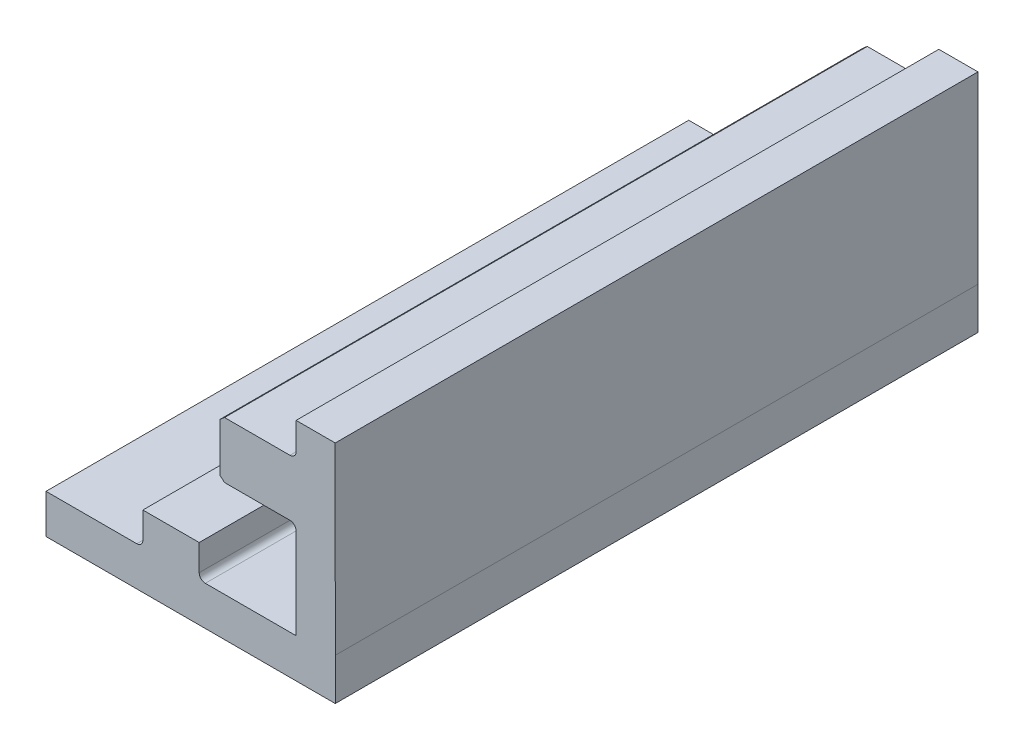
ISO-10303-21;
HEADER;
FILE_DESCRIPTION(('STEP AP214'),'2;1');
FILE_NAME('part.step','',(''),(''),'','','');
FILE_SCHEMA(('AUTOMOTIVE_DESIGN { 1 0 10303 214 1 1 1 1 }'));
ENDSEC;
DATA;
#1=APPLICATION_CONTEXT('core data for automotive mechanical design processes');
#2=APPLICATION_PROTOCOL_DEFINITION('international standard','automotive_design',2000,#1);
#3=PRODUCT_CONTEXT('',#1,'mechanical');
#4=PRODUCT('Part','Part','',(#3));
#5=PRODUCT_RELATED_PRODUCT_CATEGORY('part','',(#4));
#6=PRODUCT_DEFINITION_FORMATION('','',#4);
#7=PRODUCT_DEFINITION_CONTEXT('part definition',#1,'design');
#8=PRODUCT_DEFINITION('design','',#6,#7);
#9=PRODUCT_DEFINITION_SHAPE('','',#8);
#10=(LENGTH_UNIT() NAMED_UNIT(*) SI_UNIT(.MILLI.,.METRE.));
#11=(NAMED_UNIT(*) PLANE_ANGLE_UNIT() SI_UNIT($,.RADIAN.));
#12=(NAMED_UNIT(*) SI_UNIT($,.STERADIAN.) SOLID_ANGLE_UNIT());
#13=UNCERTAINTY_MEASURE_WITH_UNIT(LENGTH_MEASURE(1.E-05),#10,'distance_accuracy_value','');
#14=(GEOMETRIC_REPRESENTATION_CONTEXT(3) GLOBAL_UNCERTAINTY_ASSIGNED_CONTEXT((#13)) GLOBAL_UNIT_ASSIGNED_CONTEXT((#10,
#11,#12)) REPRESENTATION_CONTEXT('',''));
#15=CARTESIAN_POINT('',(0.,0.,0.));
#16=DIRECTION('',(0.,0.,1.));
#17=DIRECTION('',(1.,0.,0.));
#18=AXIS2_PLACEMENT_3D('',#15,#16,#17);
#19=CARTESIAN_POINT('',(17.7288391379452,22.9352063032006,-3749.675));
#20=DIRECTION('',(0.,-1.,0.));
#21=DIRECTION('',(0.,0.,-1.));
#22=AXIS2_PLACEMENT_3D('',#19,#20,#21);
#23=PLANE('',#22);
#24=DIRECTION('',(1.,0.,0.));
#25=VECTOR('',#24,1.);
#26=CARTESIAN_POINT('',(17.7288391379452,22.9352063032006,-3683.));
#27=LINE('',#26,#25);
#28=CARTESIAN_POINT('',(17.7288391379452,22.9352063032006,-3683.));
#29=VERTEX_POINT('',#28);
#30=CARTESIAN_POINT('',(21.7872141992322,22.9352063032006,-3683.));
#31=VERTEX_POINT('',#30);
#32=EDGE_CURVE('E296',#29,#31,#27,.T.);
#33=ORIENTED_EDGE('',*,*,#32,.T.);
#34=DIRECTION('',(0.,0.,1.));
#35=VECTOR('',#34,1.);
#36=CARTESIAN_POINT('',(21.7872141992322,22.9352063032006,-3749.675));
#37=LINE('',#36,#35);
#38=CARTESIAN_POINT('',(21.7872141992322,22.9352063032006,-3749.675));
#39=VERTEX_POINT('',#38);
#40=EDGE_CURVE('E11',#39,#31,#37,.T.);
#41=ORIENTED_EDGE('',*,*,#40,.F.);
#42=DIRECTION('',(1.,0.,0.));
#43=VECTOR('',#42,1.);
#44=CARTESIAN_POINT('',(17.7288391379452,22.9352063032006,-3749.675));
#45=LINE('',#44,#43);
#46=CARTESIAN_POINT('',(17.7288391379452,22.9352063032006,-3749.675));
#47=VERTEX_POINT('',#46);
#48=EDGE_CURVE('E230',#47,#39,#45,.T.);
#49=ORIENTED_EDGE('',*,*,#48,.F.);
#50=DIRECTION('',(0.,0.,1.));
#51=VECTOR('',#50,1.);
#52=CARTESIAN_POINT('',(17.7288391379452,22.9352063032006,-3749.675));
#53=LINE('',#52,#51);
#54=EDGE_CURVE('E231',#47,#29,#53,.T.);
#55=ORIENTED_EDGE('',*,*,#54,.T.);
#56=EDGE_LOOP('',(#33,#41,#49,#55));
#57=FACE_BOUND('',#56,.T.);
#58=ADVANCED_FACE('F33',(#57),#23,.F.);
#59=CARTESIAN_POINT('',(21.7872141992322,22.9352063032006,-3749.675));
#60=DIRECTION('',(-0.999999969550356,-0.000246777810830954,0.));
#61=DIRECTION('',(0.000246777810830954,-0.999999969550356,0.));
#62=AXIS2_PLACEMENT_3D('',#59,#60,#61);
#63=PLANE('',#62);
#64=DIRECTION('',(0.000246777810830954,-0.999999969550356,0.));
#65=VECTOR('',#64,1.);
#66=CARTESIAN_POINT('',(21.7872141992322,22.9352063032006,-3683.));
#67=LINE('',#66,#65);
#68=CARTESIAN_POINT('',(21.791921752024,3.85912878792336,-3683.));
#69=VERTEX_POINT('',#68);
#70=EDGE_CURVE('E292',#31,#69,#67,.T.);
#71=ORIENTED_EDGE('',*,*,#70,.T.);
#72=DIRECTION('',(0.,0.,1.));
#73=VECTOR('',#72,1.);
#74=CARTESIAN_POINT('',(21.791921752024,3.85912878792336,-3749.675));
#75=LINE('',#74,#73);
#76=CARTESIAN_POINT('',(21.791921752024,3.85912878792336,-3749.675));
#77=VERTEX_POINT('',#76);
#78=EDGE_CURVE('E40',#77,#69,#75,.T.);
#79=ORIENTED_EDGE('',*,*,#78,.F.);
#80=DIRECTION('',(0.000246777810830954,-0.999999969550356,0.));
#81=VECTOR('',#80,1.);
#82=CARTESIAN_POINT('',(21.7872141992322,22.9352063032006,-3749.675));
#83=LINE('',#82,#81);
#84=EDGE_CURVE('E290',#39,#77,#83,.T.);
#85=ORIENTED_EDGE('',*,*,#84,.F.);
#86=ORIENTED_EDGE('',*,*,#40,.T.);
#87=EDGE_LOOP('',(#71,#79,#85,#86));
#88=FACE_BOUND('',#87,.T.);
#89=ADVANCED_FACE('F289',(#88),#63,.F.);
#90=CARTESIAN_POINT('',(21.791921752024,-0.47513727151985,-3749.675));
#91=DIRECTION('',(-1.,0.,0.));
#92=DIRECTION('',(0.,0.,1.));
#93=AXIS2_PLACEMENT_3D('',#90,#91,#92);
#94=PLANE('',#93);
#95=DIRECTION('',(0.,-1.,0.));
#96=VECTOR('',#95,1.);
#97=CARTESIAN_POINT('',(21.791921752024,-0.47513727151985,-3683.));
#98=LINE('',#97,#96);
#99=CARTESIAN_POINT('',(21.791921752024,-0.47513727151985,-3683.));
#100=VERTEX_POINT('',#99);
#101=EDGE_CURVE('E285',#69,#100,#98,.T.);
#102=ORIENTED_EDGE('',*,*,#101,.T.);
#103=DIRECTION('',(0.,0.,1.));
#104=VECTOR('',#103,1.);
#105=CARTESIAN_POINT('',(21.791921752024,-0.47513727151985,-3749.675));
#106=LINE('',#105,#104);
#107=CARTESIAN_POINT('',(21.791921752024,-0.47513727151985,-3749.675));
#108=VERTEX_POINT('',#107);
#109=EDGE_CURVE('E276',#108,#100,#106,.T.);
#110=ORIENTED_EDGE('',*,*,#109,.F.);
#111=DIRECTION('',(0.,-1.,0.));
#112=VECTOR('',#111,1.);
#113=CARTESIAN_POINT('',(21.791921752024,3.58886272848015,-3749.675));
#114=LINE('',#113,#112);
#115=EDGE_CURVE('E286',#77,#108,#114,.T.);
#116=ORIENTED_EDGE('',*,*,#115,.F.);
#117=ORIENTED_EDGE('',*,*,#78,.T.);
#118=EDGE_LOOP('',(#102,#110,#116,#117));
#119=FACE_BOUND('',#118,.T.);
#120=ADVANCED_FACE('F283',(#119),#94,.F.);
#121=CARTESIAN_POINT('',(-8.21549203864979,-0.47513727151985,-3749.675));
#122=DIRECTION('',(0.,1.,0.));
#123=DIRECTION('',(-1.,0.,0.));
#124=AXIS2_PLACEMENT_3D('',#121,#122,#123);
#125=PLANE('',#124);
#126=DIRECTION('',(-1.,0.,0.));
#127=VECTOR('',#126,1.);
#128=CARTESIAN_POINT('',(-8.21549203864979,-0.47513727151985,-3683.));
#129=LINE('',#128,#127);
#130=CARTESIAN_POINT('',(-8.21549203864979,-0.47513727151985,-3683.));
#131=VERTEX_POINT('',#130);
#132=EDGE_CURVE('E298',#100,#131,#129,.T.);
#133=ORIENTED_EDGE('',*,*,#132,.T.);
#134=DIRECTION('',(0.,0.,1.));
#135=VECTOR('',#134,1.);
#136=CARTESIAN_POINT('',(-8.21549203864979,-0.47513727151985,-3749.675));
#137=LINE('',#136,#135);
#138=CARTESIAN_POINT('',(-8.21549203864979,-0.47513727151985,-3749.675));
#139=VERTEX_POINT('',#138);
#140=EDGE_CURVE('E273',#139,#131,#137,.T.);
#141=ORIENTED_EDGE('',*,*,#140,.F.);
#142=DIRECTION('',(-1.,0.,0.));
#143=VECTOR('',#142,1.);
#144=CARTESIAN_POINT('',(17.7279217520239,-0.47513727151985,-3749.675));
#145=LINE('',#144,#143);
#146=EDGE_CURVE('E367',#108,#139,#145,.T.);
#147=ORIENTED_EDGE('',*,*,#146,.F.);
#148=ORIENTED_EDGE('',*,*,#109,.T.);
#149=EDGE_LOOP('',(#133,#141,#147,#148));
#150=FACE_BOUND('',#149,.T.);
#151=ADVANCED_FACE('F381',(#150),#125,.F.);
#152=CARTESIAN_POINT('',(-8.21549203864979,3.58886272848015,-3749.675));
#153=DIRECTION('',(1.,0.,0.));
#154=DIRECTION('',(0.,0.,-1.));
#155=AXIS2_PLACEMENT_3D('',#152,#153,#154);
#156=PLANE('',#155);
#157=DIRECTION('',(0.,1.,0.));
#158=VECTOR('',#157,1.);
#159=CARTESIAN_POINT('',(-8.21549203864979,3.58886272848015,-3683.));
#160=LINE('',#159,#158);
#161=CARTESIAN_POINT('',(-8.21549203864979,3.58886272848015,-3683.));
#162=VERTEX_POINT('',#161);
#163=EDGE_CURVE('E305',#131,#162,#160,.T.);
#164=ORIENTED_EDGE('',*,*,#163,.T.);
#165=DIRECTION('',(0.,0.,1.));
#166=VECTOR('',#165,1.);
#167=CARTESIAN_POINT('',(-8.21549203864979,3.58886272848015,-3749.675));
#168=LINE('',#167,#166);
#169=CARTESIAN_POINT('',(-8.21549203864979,3.58886272848015,-3749.675));
#170=VERTEX_POINT('',#169);
#171=EDGE_CURVE('E270',#170,#162,#168,.T.);
#172=ORIENTED_EDGE('',*,*,#171,.F.);
#173=DIRECTION('',(0.,1.,0.));
#174=VECTOR('',#173,1.);
#175=CARTESIAN_POINT('',(-8.21549203864979,3.58886272848015,-3749.675));
#176=LINE('',#175,#174);
#177=EDGE_CURVE('E369',#139,#170,#176,.T.);
#178=ORIENTED_EDGE('',*,*,#177,.F.);
#179=ORIENTED_EDGE('',*,*,#140,.T.);
#180=EDGE_LOOP('',(#164,#172,#178,#179));
#181=FACE_BOUND('',#180,.T.);
#182=ADVANCED_FACE('F377',(#181),#156,.F.);
#183=CARTESIAN_POINT('',(-7.94526589326117,3.58886272848015,-3749.675));
#184=DIRECTION('',(0.,-1.,0.));
#185=DIRECTION('',(1.,0.,0.));
#186=AXIS2_PLACEMENT_3D('',#183,#184,#185);
#187=PLANE('',#186);
#188=DIRECTION('',(1.,0.,0.));
#189=VECTOR('',#188,1.);
#190=CARTESIAN_POINT('',(-7.94526589326117,3.58886272848015,-3683.));
#191=LINE('',#190,#189);
#192=CARTESIAN_POINT('',(1.19873410673898,3.58886272848015,-3683.));
#193=VERTEX_POINT('',#192);
#194=EDGE_CURVE('E308',#162,#193,#191,.T.);
#195=ORIENTED_EDGE('',*,*,#194,.T.);
#196=DIRECTION('',(0.,0.,1.));
#197=VECTOR('',#196,1.);
#198=CARTESIAN_POINT('',(1.19873410673898,3.58886272848015,-3749.675));
#199=LINE('',#198,#197);
#200=CARTESIAN_POINT('',(1.19873410673898,3.58886272848015,-3749.675));
#201=VERTEX_POINT('',#200);
#202=EDGE_CURVE('E267',#201,#193,#199,.T.);
#203=ORIENTED_EDGE('',*,*,#202,.F.);
#204=DIRECTION('',(1.,0.,0.));
#205=VECTOR('',#204,1.);
#206=CARTESIAN_POINT('',(-8.21549203864979,3.58886272848015,-3749.675));
#207=LINE('',#206,#205);
#208=EDGE_CURVE('E325',#170,#201,#207,.T.);
#209=ORIENTED_EDGE('',*,*,#208,.F.);
#210=ORIENTED_EDGE('',*,*,#171,.T.);
#211=EDGE_LOOP('',(#195,#203,#209,#210));
#212=FACE_BOUND('',#211,.T.);
#213=ADVANCED_FACE('F374',(#212),#187,.F.);
#214=CARTESIAN_POINT('',(1.19873410673898,4.22386272848,-3749.675));
#215=DIRECTION('',(0.,0.,1.));
#216=DIRECTION('',(1.,0.,0.));
#217=AXIS2_PLACEMENT_3D('',#214,#215,#216);
#218=CYLINDRICAL_SURFACE('',#217,0.634999999999852);
#219=CARTESIAN_POINT('',(1.19873410673898,4.22386272848,-3683.));
#220=DIRECTION('',(0.,0.,1.));
#221=DIRECTION('',(1.,0.,0.));
#222=AXIS2_PLACEMENT_3D('',#219,#220,#221);
#223=CIRCLE('',#222,0.634999999999852);
#224=CARTESIAN_POINT('',(1.83373410673883,4.22386272848,-3683.));
#225=VERTEX_POINT('',#224);
#226=EDGE_CURVE('E205',#193,#225,#223,.T.);
#227=ORIENTED_EDGE('',*,*,#226,.T.);
#228=DIRECTION('',(0.,0.,1.));
#229=VECTOR('',#228,1.);
#230=CARTESIAN_POINT('',(1.83373410673883,4.22386272848,-3749.675));
#231=LINE('',#230,#229);
#232=CARTESIAN_POINT('',(1.83373410673883,4.22386272848,-3749.675));
#233=VERTEX_POINT('',#232);
#234=EDGE_CURVE('E264',#233,#225,#231,.T.);
#235=ORIENTED_EDGE('',*,*,#234,.F.);
#236=CARTESIAN_POINT('',(1.19873410673898,4.22386272848,-3749.675));
#237=DIRECTION('',(0.,0.,1.));
#238=DIRECTION('',(1.,0.,0.));
#239=AXIS2_PLACEMENT_3D('',#236,#237,#238);
#240=CIRCLE('',#239,0.634999999999852);
#241=EDGE_CURVE('E321',#201,#233,#240,.T.);
#242=ORIENTED_EDGE('',*,*,#241,.F.);
#243=ORIENTED_EDGE('',*,*,#202,.T.);
#244=EDGE_LOOP('',(#227,#235,#242,#243));
#245=FACE_BOUND('',#244,.T.);
#246=ADVANCED_FACE('F312',(#245),#218,.F.);
#247=CARTESIAN_POINT('',(1.83373410673883,4.22386272848,-3749.675));
#248=DIRECTION('',(1.,0.,0.));
#249=DIRECTION('',(0.,0.,-1.));
#250=AXIS2_PLACEMENT_3D('',#247,#248,#249);
#251=PLANE('',#250);
#252=DIRECTION('',(0.,1.,0.));
#253=VECTOR('',#252,1.);
#254=CARTESIAN_POINT('',(1.83373410673883,4.22386272848,-3683.));
#255=LINE('',#254,#253);
#256=CARTESIAN_POINT('',(1.83373410673883,6.93539089348943,-3683.));
#257=VERTEX_POINT('',#256);
#258=EDGE_CURVE('E201',#225,#257,#255,.T.);
#259=ORIENTED_EDGE('',*,*,#258,.T.);
#260=DIRECTION('',(0.,0.,-1.));
#261=VECTOR('',#260,1.);
#262=CARTESIAN_POINT('',(1.83373410673883,6.93539089348943,-3683.));
#263=LINE('',#262,#261);
#264=CARTESIAN_POINT('',(1.83373410673883,6.93539089348943,-3749.675));
#265=VERTEX_POINT('',#264);
#266=EDGE_CURVE('E47',#257,#265,#263,.T.);
#267=ORIENTED_EDGE('',*,*,#266,.T.);
#268=DIRECTION('',(0.,1.,0.));
#269=VECTOR('',#268,1.);
#270=CARTESIAN_POINT('',(1.83373410673883,4.22386272848,-3749.675));
#271=LINE('',#270,#269);
#272=EDGE_CURVE('E319',#233,#265,#271,.T.);
#273=ORIENTED_EDGE('',*,*,#272,.F.);
#274=ORIENTED_EDGE('',*,*,#234,.T.);
#275=EDGE_LOOP('',(#259,#267,#273,#274));
#276=FACE_BOUND('',#275,.T.);
#277=ADVANCED_FACE('F317',(#276),#251,.F.);
#278=CARTESIAN_POINT('',(7.67573410673884,5.7478627284803,-3749.675));
#279=DIRECTION('',(-1.,0.,0.));
#280=DIRECTION('',(0.,0.,1.));
#281=AXIS2_PLACEMENT_3D('',#278,#279,#280);
#282=PLANE('',#281);
#283=DIRECTION('',(0.,-1.,0.));
#284=VECTOR('',#283,1.);
#285=CARTESIAN_POINT('',(7.67573410673884,5.7478627284803,-3749.675));
#286=LINE('',#285,#284);
#287=CARTESIAN_POINT('',(7.67573410673884,6.93539089348943,-3749.675));
#288=VERTEX_POINT('',#287);
#289=CARTESIAN_POINT('',(7.67573410673884,4.22386272848,-3749.675));
#290=VERTEX_POINT('',#289);
#291=EDGE_CURVE('E195',#288,#290,#286,.T.);
#292=ORIENTED_EDGE('',*,*,#291,.F.);
#293=DIRECTION('',(0.,0.,-1.));
#294=VECTOR('',#293,1.);
#295=CARTESIAN_POINT('',(7.67573410673884,6.93539089348943,-3683.));
#296=LINE('',#295,#294);
#297=CARTESIAN_POINT('',(7.67573410673884,6.93539089348943,-3683.));
#298=VERTEX_POINT('',#297);
#299=EDGE_CURVE('E182',#298,#288,#296,.T.);
#300=ORIENTED_EDGE('',*,*,#299,.F.);
#301=DIRECTION('',(0.,-1.,0.));
#302=VECTOR('',#301,1.);
#303=CARTESIAN_POINT('',(7.67573410673884,5.7478627284803,-3683.));
#304=LINE('',#303,#302);
#305=CARTESIAN_POINT('',(7.67573410673884,4.22386272848,-3683.));
#306=VERTEX_POINT('',#305);
#307=EDGE_CURVE('E193',#298,#306,#304,.T.);
#308=ORIENTED_EDGE('',*,*,#307,.T.);
#309=DIRECTION('',(0.,0.,1.));
#310=VECTOR('',#309,1.);
#311=CARTESIAN_POINT('',(7.67573410673884,4.22386272848,-3749.675));
#312=LINE('',#311,#310);
#313=EDGE_CURVE('E262',#290,#306,#312,.T.);
#314=ORIENTED_EDGE('',*,*,#313,.F.);
#315=EDGE_LOOP('',(#292,#300,#308,#314));
#316=FACE_BOUND('',#315,.T.);
#317=ADVANCED_FACE('F191',(#316),#282,.F.);
#318=CARTESIAN_POINT('',(8.31073410673869,4.22386272848,-3749.675));
#319=DIRECTION('',(0.,0.,1.));
#320=DIRECTION('',(1.,0.,0.));
#321=AXIS2_PLACEMENT_3D('',#318,#319,#320);
#322=CYLINDRICAL_SURFACE('',#321,0.634999999999847);
#323=CARTESIAN_POINT('',(8.31073410673869,4.22386272848,-3683.));
#324=DIRECTION('',(0.,0.,1.));
#325=DIRECTION('',(1.,0.,0.));
#326=AXIS2_PLACEMENT_3D('',#323,#324,#325);
#327=CIRCLE('',#326,0.634999999999847);
#328=CARTESIAN_POINT('',(8.31073410673869,3.58886272848015,-3683.));
#329=VERTEX_POINT('',#328);
#330=EDGE_CURVE('E200',#306,#329,#327,.T.);
#331=ORIENTED_EDGE('',*,*,#330,.T.);
#332=DIRECTION('',(0.,0.,1.));
#333=VECTOR('',#332,1.);
#334=CARTESIAN_POINT('',(8.31073410673869,3.58886272848015,-3749.675));
#335=LINE('',#334,#333);
#336=CARTESIAN_POINT('',(8.31073410673869,3.58886272848015,-3749.675));
#337=VERTEX_POINT('',#336);
#338=EDGE_CURVE('E259',#337,#329,#335,.T.);
#339=ORIENTED_EDGE('',*,*,#338,.F.);
#340=CARTESIAN_POINT('',(8.31073410673869,4.22386272848,-3749.675));
#341=DIRECTION('',(0.,0.,1.));
#342=DIRECTION('',(1.,0.,0.));
#343=AXIS2_PLACEMENT_3D('',#340,#341,#342);
#344=CIRCLE('',#343,0.634999999999847);
#345=EDGE_CURVE('E323',#290,#337,#344,.T.);
#346=ORIENTED_EDGE('',*,*,#345,.F.);
#347=ORIENTED_EDGE('',*,*,#313,.T.);
#348=EDGE_LOOP('',(#331,#339,#346,#347));
#349=FACE_BOUND('',#348,.T.);
#350=ADVANCED_FACE('F437',(#349),#322,.F.);
#351=CARTESIAN_POINT('',(17.4547341067388,3.58886272848015,-3749.675));
#352=DIRECTION('',(0.,-1.,0.));
#353=DIRECTION('',(1.,0.,0.));
#354=AXIS2_PLACEMENT_3D('',#351,#352,#353);
#355=PLANE('',#354);
#356=DIRECTION('',(1.,0.,0.));
#357=VECTOR('',#356,1.);
#358=CARTESIAN_POINT('',(17.4547341067388,3.58886272848015,-3683.));
#359=LINE('',#358,#357);
#360=CARTESIAN_POINT('',(17.7279217520239,3.58886272848015,-3683.));
#361=VERTEX_POINT('',#360);
#362=EDGE_CURVE('E203',#329,#361,#359,.T.);
#363=ORIENTED_EDGE('',*,*,#362,.T.);
#364=DIRECTION('',(0.,0.,1.));
#365=VECTOR('',#364,1.);
#366=CARTESIAN_POINT('',(17.7279217520239,3.58886272848015,-3749.675));
#367=LINE('',#366,#365);
#368=CARTESIAN_POINT('',(17.7279217520239,3.58886272848015,-3749.675));
#369=VERTEX_POINT('',#368);
#370=EDGE_CURVE('E256',#369,#361,#367,.T.);
#371=ORIENTED_EDGE('',*,*,#370,.F.);
#372=DIRECTION('',(1.,0.,0.));
#373=VECTOR('',#372,1.);
#374=CARTESIAN_POINT('',(8.31073410673869,3.58886272848015,-3749.675));
#375=LINE('',#374,#373);
#376=EDGE_CURVE('E330',#337,#369,#375,.T.);
#377=ORIENTED_EDGE('',*,*,#376,.F.);
#378=ORIENTED_EDGE('',*,*,#338,.T.);
#379=EDGE_LOOP('',(#363,#371,#377,#378));
#380=FACE_BOUND('',#379,.T.);
#381=ADVANCED_FACE('F442',(#380),#355,.F.);
#382=CARTESIAN_POINT('',(17.7279217520239,3.58886272848015,-3749.675));
#383=DIRECTION('',(1.,0.,0.));
#384=DIRECTION('',(0.,0.,-1.));
#385=AXIS2_PLACEMENT_3D('',#382,#383,#384);
#386=PLANE('',#385);
#387=DIRECTION('',(0.,1.,0.));
#388=VECTOR('',#387,1.);
#389=CARTESIAN_POINT('',(17.7279217520239,3.58886272848015,-3683.));
#390=LINE('',#389,#388);
#391=CARTESIAN_POINT('',(17.7279217520239,3.85884275420049,-3683.));
#392=VERTEX_POINT('',#391);
#393=EDGE_CURVE('E210',#361,#392,#390,.T.);
#394=ORIENTED_EDGE('',*,*,#393,.T.);
#395=DIRECTION('',(0.,0.,1.));
#396=VECTOR('',#395,1.);
#397=CARTESIAN_POINT('',(17.7279217520239,3.85884275420049,-3749.675));
#398=LINE('',#397,#396);
#399=CARTESIAN_POINT('',(17.7279217520239,3.85884275420049,-3749.675));
#400=VERTEX_POINT('',#399);
#401=EDGE_CURVE('E253',#400,#392,#398,.T.);
#402=ORIENTED_EDGE('',*,*,#401,.F.);
#403=DIRECTION('',(0.,1.,0.));
#404=VECTOR('',#403,1.);
#405=CARTESIAN_POINT('',(17.7279217520239,3.58886272848015,-3749.675));
#406=LINE('',#405,#404);
#407=EDGE_CURVE('E332',#369,#400,#406,.T.);
#408=ORIENTED_EDGE('',*,*,#407,.F.);
#409=ORIENTED_EDGE('',*,*,#370,.T.);
#410=EDGE_LOOP('',(#394,#402,#408,#409));
#411=FACE_BOUND('',#410,.T.);
#412=ADVANCED_FACE('F455',(#411),#386,.F.);
#413=CARTESIAN_POINT('',(17.7279217520239,3.85884275420049,-3749.675));
#414=DIRECTION('',(0.999999998843667,-4.80901885618899E-05,0.));
#415=DIRECTION('',(4.80901885618899E-05,0.999999998843667,0.));
#416=AXIS2_PLACEMENT_3D('',#413,#414,#415);
#417=PLANE('',#416);
#418=DIRECTION('',(4.80901885618899E-05,0.999999998843667,0.));
#419=VECTOR('',#418,1.);
#420=CARTESIAN_POINT('',(17.7279217520239,3.85884275420049,-3683.));
#421=LINE('',#420,#419);
#422=CARTESIAN_POINT('',(17.7283614660931,13.002372480981,-3683.));
#423=VERTEX_POINT('',#422);
#424=EDGE_CURVE('E212',#392,#423,#421,.T.);
#425=ORIENTED_EDGE('',*,*,#424,.T.);
#426=DIRECTION('',(0.,0.,1.));
#427=VECTOR('',#426,1.);
#428=CARTESIAN_POINT('',(17.7283614660931,13.002372480981,-3749.675));
#429=LINE('',#428,#427);
#430=CARTESIAN_POINT('',(17.7283614660931,13.002372480981,-3749.675));
#431=VERTEX_POINT('',#430);
#432=EDGE_CURVE('E250',#431,#423,#429,.T.);
#433=ORIENTED_EDGE('',*,*,#432,.F.);
#434=DIRECTION('',(4.80901885618899E-05,0.999999998843667,0.));
#435=VECTOR('',#434,1.);
#436=CARTESIAN_POINT('',(17.7279217520239,3.85884275420049,-3749.675));
#437=LINE('',#436,#435);
#438=EDGE_CURVE('E334',#400,#431,#437,.T.);
#439=ORIENTED_EDGE('',*,*,#438,.F.);
#440=ORIENTED_EDGE('',*,*,#401,.T.);
#441=EDGE_LOOP('',(#425,#433,#439,#440));
#442=FACE_BOUND('',#441,.T.);
#443=ADVANCED_FACE('F465',(#442),#417,.F.);
#444=CARTESIAN_POINT('',(17.0929217520241,13.0024030393967,-3749.675));
#445=DIRECTION('',(0.,0.,1.));
#446=DIRECTION('',(1.,0.,0.));
#447=AXIS2_PLACEMENT_3D('',#444,#445,#446);
#448=CYLINDRICAL_SURFACE('',#447,0.635439714803768);
#449=CARTESIAN_POINT('',(17.0929217520241,13.0024030393967,-3683.));
#450=DIRECTION('',(0.,0.,1.));
#451=DIRECTION('',(1.,0.,0.));
#452=AXIS2_PLACEMENT_3D('',#449,#450,#451);
#453=CIRCLE('',#452,0.635439714803768);
#454=CARTESIAN_POINT('',(17.0929217520241,13.6378427542005,-3683.));
#455=VERTEX_POINT('',#454);
#456=EDGE_CURVE('E214',#423,#455,#453,.T.);
#457=ORIENTED_EDGE('',*,*,#456,.T.);
#458=DIRECTION('',(0.,0.,1.));
#459=VECTOR('',#458,1.);
#460=CARTESIAN_POINT('',(17.0929217520241,13.6378427542005,-3749.675));
#461=LINE('',#460,#459);
#462=CARTESIAN_POINT('',(17.0929217520241,13.6378427542005,-3749.675));
#463=VERTEX_POINT('',#462);
#464=EDGE_CURVE('E247',#463,#455,#461,.T.);
#465=ORIENTED_EDGE('',*,*,#464,.F.);
#466=CARTESIAN_POINT('',(17.0929217520241,13.0024030393967,-3749.675));
#467=DIRECTION('',(0.,0.,1.));
#468=DIRECTION('',(1.,0.,0.));
#469=AXIS2_PLACEMENT_3D('',#466,#467,#468);
#470=CIRCLE('',#469,0.635439714803768);
#471=EDGE_CURVE('E336',#431,#463,#470,.T.);
#472=ORIENTED_EDGE('',*,*,#471,.F.);
#473=ORIENTED_EDGE('',*,*,#432,.T.);
#474=EDGE_LOOP('',(#457,#465,#472,#473));
#475=FACE_BOUND('',#474,.T.);
#476=ADVANCED_FACE('F475',(#475),#448,.F.);
#477=CARTESIAN_POINT('',(17.0929217520241,13.6378427542005,-3749.675));
#478=DIRECTION('',(0.,1.,0.));
#479=DIRECTION('',(-1.,0.,0.));
#480=AXIS2_PLACEMENT_3D('',#477,#478,#479);
#481=PLANE('',#480);
#482=DIRECTION('',(-1.,0.,0.));
#483=VECTOR('',#482,1.);
#484=CARTESIAN_POINT('',(17.0929217520241,13.6378427542005,-3683.));
#485=LINE('',#484,#483);
#486=CARTESIAN_POINT('',(10.3079798708025,13.6378427542006,-3683.));
#487=VERTEX_POINT('',#486);
#488=EDGE_CURVE('E216',#455,#487,#485,.T.);
#489=ORIENTED_EDGE('',*,*,#488,.T.);
#490=DIRECTION('',(0.,0.,1.));
#491=VECTOR('',#490,1.);
#492=CARTESIAN_POINT('',(10.3079798708025,13.6378427542006,-3749.676));
#493=LINE('',#492,#491);
#494=CARTESIAN_POINT('',(10.3079798708025,13.6378427542006,-3749.675));
#495=VERTEX_POINT('',#494);
#496=EDGE_CURVE('E363',#495,#487,#493,.T.);
#497=ORIENTED_EDGE('',*,*,#496,.F.);
#498=DIRECTION('',(-1.,0.,0.));
#499=VECTOR('',#498,1.);
#500=CARTESIAN_POINT('',(17.0929217520241,13.6378427542005,-3749.675));
#501=LINE('',#500,#499);
#502=EDGE_CURVE('E338',#463,#495,#501,.T.);
#503=ORIENTED_EDGE('',*,*,#502,.F.);
#504=ORIENTED_EDGE('',*,*,#464,.T.);
#505=EDGE_LOOP('',(#489,#497,#503,#504));
#506=FACE_BOUND('',#505,.T.);
#507=ADVANCED_FACE('F485',(#506),#481,.F.);
#508=CARTESIAN_POINT('',(14.4259217940422,10.1824792052005,-3749.675));
#509=DIRECTION('',(0.642787609686549,0.76604444311897,0.));
#510=DIRECTION('',(-0.76604444311897,0.642787609686549,0.));
#511=AXIS2_PLACEMENT_3D('',#508,#509,#510);
#512=PLANE('',#511);
#513=DIRECTION('',(-0.76604444311897,0.642787609686549,0.));
#514=VECTOR('',#513,1.);
#515=CARTESIAN_POINT('',(14.4259217940422,10.1824792052005,-3749.675));
#516=LINE('',#515,#514);
#517=CARTESIAN_POINT('',(9.85392175202405,14.0188427542006,-3749.675));
#518=VERTEX_POINT('',#517);
#519=EDGE_CURVE('E340',#495,#518,#516,.T.);
#520=ORIENTED_EDGE('',*,*,#519,.F.);
#521=ORIENTED_EDGE('',*,*,#496,.T.);
#522=DIRECTION('',(-0.76604444311897,0.642787609686549,0.));
#523=VECTOR('',#522,1.);
#524=CARTESIAN_POINT('',(14.4259217940422,10.1824792052005,-3683.));
#525=LINE('',#524,#523);
#526=CARTESIAN_POINT('',(9.85392175202405,14.0188427542006,-3683.));
#527=VERTEX_POINT('',#526);
#528=EDGE_CURVE('E218',#487,#527,#525,.T.);
#529=ORIENTED_EDGE('',*,*,#528,.T.);
#530=DIRECTION('',(0.,0.,1.));
#531=VECTOR('',#530,1.);
#532=CARTESIAN_POINT('',(9.85392175202405,14.0188427542006,-3749.675));
#533=LINE('',#532,#531);
#534=EDGE_CURVE('E244',#518,#527,#533,.T.);
#535=ORIENTED_EDGE('',*,*,#534,.F.);
#536=EDGE_LOOP('',(#520,#521,#529,#535));
#537=FACE_BOUND('',#536,.T.);
#538=ADVANCED_FACE('F499',(#537),#512,.F.);
#539=CARTESIAN_POINT('',(9.85392175202405,14.0188427542006,-3749.675));
#540=DIRECTION('',(1.,0.,0.));
#541=DIRECTION('',(0.,0.,-1.));
#542=AXIS2_PLACEMENT_3D('',#539,#540,#541);
#543=PLANE('',#542);
#544=DIRECTION('',(0.,1.,0.));
#545=VECTOR('',#544,1.);
#546=CARTESIAN_POINT('',(9.85392175202405,14.0188427542006,-3683.));
#547=LINE('',#546,#545);
#548=CARTESIAN_POINT('',(9.85392175202405,19.0988427542006,-3683.));
#549=VERTEX_POINT('',#548);
#550=EDGE_CURVE('E220',#527,#549,#547,.T.);
#551=ORIENTED_EDGE('',*,*,#550,.T.);
#552=DIRECTION('',(0.,0.,1.));
#553=VECTOR('',#552,1.);
#554=CARTESIAN_POINT('',(9.85392175202405,19.0988427542006,-3749.675));
#555=LINE('',#554,#553);
#556=CARTESIAN_POINT('',(9.85392175202405,19.0988427542006,-3749.675));
#557=VERTEX_POINT('',#556);
#558=EDGE_CURVE('E241',#557,#549,#555,.T.);
#559=ORIENTED_EDGE('',*,*,#558,.F.);
#560=DIRECTION('',(0.,1.,0.));
#561=VECTOR('',#560,1.);
#562=CARTESIAN_POINT('',(9.85392175202405,14.0188427542006,-3749.675));
#563=LINE('',#562,#561);
#564=EDGE_CURVE('E342',#518,#557,#563,.T.);
#565=ORIENTED_EDGE('',*,*,#564,.F.);
#566=ORIENTED_EDGE('',*,*,#534,.T.);
#567=EDGE_LOOP('',(#551,#559,#565,#566));
#568=FACE_BOUND('',#567,.T.);
#569=ADVANCED_FACE('F493',(#568),#543,.F.);
#570=CARTESIAN_POINT('',(9.85392175202405,19.0988427542006,-3749.675));
#571=DIRECTION('',(0.642787609686534,-0.766044443118982,0.));
#572=DIRECTION('',(0.766044443118983,0.642787609686534,0.));
#573=AXIS2_PLACEMENT_3D('',#570,#571,#572);
#574=PLANE('',#573);
#575=DIRECTION('',(0.766044443118983,0.642787609686534,0.));
#576=VECTOR('',#575,1.);
#577=CARTESIAN_POINT('',(9.85392175202405,19.0988427542006,-3683.));
#578=LINE('',#577,#576);
#579=CARTESIAN_POINT('',(10.3079798708025,19.4798427542007,-3683.));
#580=VERTEX_POINT('',#579);
#581=EDGE_CURVE('E222',#549,#580,#578,.T.);
#582=ORIENTED_EDGE('',*,*,#581,.T.);
#583=DIRECTION('',(0.,0.,1.));
#584=VECTOR('',#583,1.);
#585=CARTESIAN_POINT('',(10.3079798708025,19.4798427542007,-3749.676));
#586=LINE('',#585,#584);
#587=CARTESIAN_POINT('',(10.3079798708025,19.4798427542007,-3749.675));
#588=VERTEX_POINT('',#587);
#589=EDGE_CURVE('E300',#588,#580,#586,.T.);
#590=ORIENTED_EDGE('',*,*,#589,.F.);
#591=DIRECTION('',(0.766044443118983,0.642787609686534,0.));
#592=VECTOR('',#591,1.);
#593=CARTESIAN_POINT('',(9.85392175202405,19.0988427542006,-3749.675));
#594=LINE('',#593,#592);
#595=EDGE_CURVE('E344',#557,#588,#594,.T.);
#596=ORIENTED_EDGE('',*,*,#595,.F.);
#597=ORIENTED_EDGE('',*,*,#558,.T.);
#598=EDGE_LOOP('',(#582,#590,#596,#597));
#599=FACE_BOUND('',#598,.T.);
#600=ADVANCED_FACE('F498',(#599),#574,.F.);
#601=CARTESIAN_POINT('',(15.568921752024,19.4798427542007,-3749.675));
#602=DIRECTION('',(0.,-1.,0.));
#603=DIRECTION('',(0.,0.,-1.));
#604=AXIS2_PLACEMENT_3D('',#601,#602,#603);
#605=PLANE('',#604);
#606=DIRECTION('',(1.,0.,0.));
#607=VECTOR('',#606,1.);
#608=CARTESIAN_POINT('',(15.568921752024,19.4798427542007,-3683.));
#609=LINE('',#608,#607);
#610=CARTESIAN_POINT('',(17.0929217520242,19.4798427542007,-3683.));
#611=VERTEX_POINT('',#610);
#612=EDGE_CURVE('E55',#580,#611,#609,.T.);
#613=ORIENTED_EDGE('',*,*,#612,.T.);
#614=DIRECTION('',(0.,0.,1.));
#615=VECTOR('',#614,1.);
#616=CARTESIAN_POINT('',(17.0929217520242,19.4798427542007,-3749.675));
#617=LINE('',#616,#615);
#618=CARTESIAN_POINT('',(17.0929217520242,19.4798427542007,-3749.675));
#619=VERTEX_POINT('',#618);
#620=EDGE_CURVE('E238',#619,#611,#617,.T.);
#621=ORIENTED_EDGE('',*,*,#620,.F.);
#622=DIRECTION('',(1.,0.,0.));
#623=VECTOR('',#622,1.);
#624=CARTESIAN_POINT('',(15.568921752024,19.4798427542007,-3749.675));
#625=LINE('',#624,#623);
#626=EDGE_CURVE('E347',#588,#619,#625,.T.);
#627=ORIENTED_EDGE('',*,*,#626,.F.);
#628=ORIENTED_EDGE('',*,*,#589,.T.);
#629=EDGE_LOOP('',(#613,#621,#627,#628));
#630=FACE_BOUND('',#629,.T.);
#631=ADVANCED_FACE('F514',(#630),#605,.F.);
#632=CARTESIAN_POINT('',(17.0929217520242,20.1156245451678,-3749.675));
#633=DIRECTION('',(0.,0.,1.));
#634=DIRECTION('',(1.,0.,0.));
#635=AXIS2_PLACEMENT_3D('',#632,#633,#634);
#636=CYLINDRICAL_SURFACE('',#635,0.635781790967193);
#637=CARTESIAN_POINT('',(17.0929217520242,20.1156245451678,-3683.));
#638=DIRECTION('',(0.,0.,1.));
#639=DIRECTION('',(1.,0.,0.));
#640=AXIS2_PLACEMENT_3D('',#637,#638,#639);
#641=CIRCLE('',#640,0.635781790967193);
#642=CARTESIAN_POINT('',(17.7287035422562,20.1155939703016,-3683.));
#643=VERTEX_POINT('',#642);
#644=EDGE_CURVE('E226',#611,#643,#641,.T.);
#645=ORIENTED_EDGE('',*,*,#644,.T.);
#646=DIRECTION('',(0.,0.,1.));
#647=VECTOR('',#646,1.);
#648=CARTESIAN_POINT('',(17.7287035422562,20.1155939703016,-3749.675));
#649=LINE('',#648,#647);
#650=CARTESIAN_POINT('',(17.7287035422562,20.1155939703016,-3749.675));
#651=VERTEX_POINT('',#650);
#652=EDGE_CURVE('E234',#651,#643,#649,.T.);
#653=ORIENTED_EDGE('',*,*,#652,.F.);
#654=CARTESIAN_POINT('',(17.0929217520242,20.1156245451678,-3749.675));
#655=DIRECTION('',(0.,0.,1.));
#656=DIRECTION('',(1.,0.,0.));
#657=AXIS2_PLACEMENT_3D('',#654,#655,#656);
#658=CIRCLE('',#657,0.635781790967193);
#659=EDGE_CURVE('E349',#619,#651,#658,.T.);
#660=ORIENTED_EDGE('',*,*,#659,.F.);
#661=ORIENTED_EDGE('',*,*,#620,.T.);
#662=EDGE_LOOP('',(#645,#653,#660,#661));
#663=FACE_BOUND('',#662,.T.);
#664=ADVANCED_FACE('F509',(#663),#636,.F.);
#665=CARTESIAN_POINT('',(17.7287035422562,20.1155939703016,-3749.675));
#666=DIRECTION('',(0.999999998843667,-4.80901885604205E-05,0.));
#667=DIRECTION('',(4.80901885604206E-05,0.999999998843667,0.));
#668=AXIS2_PLACEMENT_3D('',#665,#666,#667);
#669=PLANE('',#668);
#670=DIRECTION('',(4.80901885604206E-05,0.999999998843667,0.));
#671=VECTOR('',#670,1.);
#672=CARTESIAN_POINT('',(17.7287035422562,20.1155939703016,-3683.));
#673=LINE('',#672,#671);
#674=EDGE_CURVE('E228',#643,#29,#673,.T.);
#675=ORIENTED_EDGE('',*,*,#674,.T.);
#676=ORIENTED_EDGE('',*,*,#54,.F.);
#677=DIRECTION('',(4.80901885604206E-05,0.999999998843667,0.));
#678=VECTOR('',#677,1.);
#679=CARTESIAN_POINT('',(17.7287035422562,20.1155939703016,-3749.675));
#680=LINE('',#679,#678);
#681=EDGE_CURVE('E235',#651,#47,#680,.T.);
#682=ORIENTED_EDGE('',*,*,#681,.F.);
#683=ORIENTED_EDGE('',*,*,#652,.T.);
#684=EDGE_LOOP('',(#675,#676,#682,#683));
#685=FACE_BOUND('',#684,.T.);
#686=ADVANCED_FACE('F357',(#685),#669,.F.);
#687=CARTESIAN_POINT('',(1.19873410673898,4.22386272848,-3749.675));
#688=DIRECTION('',(0.,0.,1.));
#689=DIRECTION('',(1.,0.,0.));
#690=AXIS2_PLACEMENT_3D('',#687,#688,#689);
#691=PLANE('',#690);
#692=ORIENTED_EDGE('',*,*,#272,.T.);
#693=DIRECTION('',(-1.,0.,0.));
#694=VECTOR('',#693,1.);
#695=CARTESIAN_POINT('',(1.83373410673883,6.93539089348943,-3749.675));
#696=LINE('',#695,#694);
#697=EDGE_CURVE('E187',#288,#265,#696,.T.);
#698=ORIENTED_EDGE('',*,*,#697,.F.);
#699=ORIENTED_EDGE('',*,*,#291,.T.);
#700=ORIENTED_EDGE('',*,*,#345,.T.);
#701=ORIENTED_EDGE('',*,*,#376,.T.);
#702=ORIENTED_EDGE('',*,*,#407,.T.);
#703=ORIENTED_EDGE('',*,*,#438,.T.);
#704=ORIENTED_EDGE('',*,*,#471,.T.);
#705=ORIENTED_EDGE('',*,*,#502,.T.);
#706=ORIENTED_EDGE('',*,*,#519,.T.);
#707=ORIENTED_EDGE('',*,*,#564,.T.);
#708=ORIENTED_EDGE('',*,*,#595,.T.);
#709=ORIENTED_EDGE('',*,*,#626,.T.);
#710=ORIENTED_EDGE('',*,*,#659,.T.);
#711=ORIENTED_EDGE('',*,*,#681,.T.);
#712=ORIENTED_EDGE('',*,*,#48,.T.);
#713=ORIENTED_EDGE('',*,*,#84,.T.);
#714=ORIENTED_EDGE('',*,*,#115,.T.);
#715=ORIENTED_EDGE('',*,*,#146,.T.);
#716=ORIENTED_EDGE('',*,*,#177,.T.);
#717=ORIENTED_EDGE('',*,*,#208,.T.);
#718=ORIENTED_EDGE('',*,*,#241,.T.);
#719=EDGE_LOOP('',(#692,#698,#699,#700,#701,#702,#703,#704,#705,#706,#707,#708,#709,#710,#711,
#712,#713,#714,#715,#716,#717,#718));
#720=FACE_BOUND('',#719,.T.);
#721=ADVANCED_FACE('F352',(#720),#691,.F.);
#722=CARTESIAN_POINT('',(1.19873410673898,4.22386272848,-3683.));
#723=DIRECTION('',(0.,0.,1.));
#724=DIRECTION('',(1.,0.,0.));
#725=AXIS2_PLACEMENT_3D('',#722,#723,#724);
#726=PLANE('',#725);
#727=DIRECTION('',(-1.,0.,0.));
#728=VECTOR('',#727,1.);
#729=CARTESIAN_POINT('',(1.83373410673883,6.93539089348943,-3683.));
#730=LINE('',#729,#728);
#731=EDGE_CURVE('E179',#298,#257,#730,.T.);
#732=ORIENTED_EDGE('',*,*,#731,.T.);
#733=ORIENTED_EDGE('',*,*,#258,.F.);
#734=ORIENTED_EDGE('',*,*,#226,.F.);
#735=ORIENTED_EDGE('',*,*,#194,.F.);
#736=ORIENTED_EDGE('',*,*,#163,.F.);
#737=ORIENTED_EDGE('',*,*,#132,.F.);
#738=ORIENTED_EDGE('',*,*,#101,.F.);
#739=ORIENTED_EDGE('',*,*,#70,.F.);
#740=ORIENTED_EDGE('',*,*,#32,.F.);
#741=ORIENTED_EDGE('',*,*,#674,.F.);
#742=ORIENTED_EDGE('',*,*,#644,.F.);
#743=ORIENTED_EDGE('',*,*,#612,.F.);
#744=ORIENTED_EDGE('',*,*,#581,.F.);
#745=ORIENTED_EDGE('',*,*,#550,.F.);
#746=ORIENTED_EDGE('',*,*,#528,.F.);
#747=ORIENTED_EDGE('',*,*,#488,.F.);
#748=ORIENTED_EDGE('',*,*,#456,.F.);
#749=ORIENTED_EDGE('',*,*,#424,.F.);
#750=ORIENTED_EDGE('',*,*,#393,.F.);
#751=ORIENTED_EDGE('',*,*,#362,.F.);
#752=ORIENTED_EDGE('',*,*,#330,.F.);
#753=ORIENTED_EDGE('',*,*,#307,.F.);
#754=EDGE_LOOP('',(#732,#733,#734,#735,#736,#737,#738,#739,#740,#741,#742,#743,#744,#745,#746,
#747,#748,#749,#750,#751,#752,#753));
#755=FACE_BOUND('',#754,.T.);
#756=ADVANCED_FACE('F198',(#755),#726,.T.);
#757=CARTESIAN_POINT('',(1.83373410673883,6.93539089348943,-3683.));
#758=DIRECTION('',(0.,-1.,0.));
#759=DIRECTION('',(1.,0.,0.));
#760=AXIS2_PLACEMENT_3D('',#757,#758,#759);
#761=PLANE('',#760);
#762=ORIENTED_EDGE('',*,*,#697,.T.);
#763=ORIENTED_EDGE('',*,*,#266,.F.);
#764=ORIENTED_EDGE('',*,*,#731,.F.);
#765=ORIENTED_EDGE('',*,*,#299,.T.);
#766=EDGE_LOOP('',(#762,#763,#764,#765));
#767=FACE_BOUND('',#766,.T.);
#768=ADVANCED_FACE('F181',(#767),#761,.F.);
#769=CLOSED_SHELL('',(#58,#89,#120,#151,#182,#213,#246,#277,#317,#350,#381,#412,#443,#476,#507,
#538,#569,#600,#631,#664,#686,#721,#756,#768));
#770=MANIFOLD_SOLID_BREP('B2',#769);
#771=ADVANCED_BREP_SHAPE_REPRESENTATION('',(#18,#770),#14);
#772=SHAPE_DEFINITION_REPRESENTATION(#9,#771);
ENDSEC;
END-ISO-10303-21;
